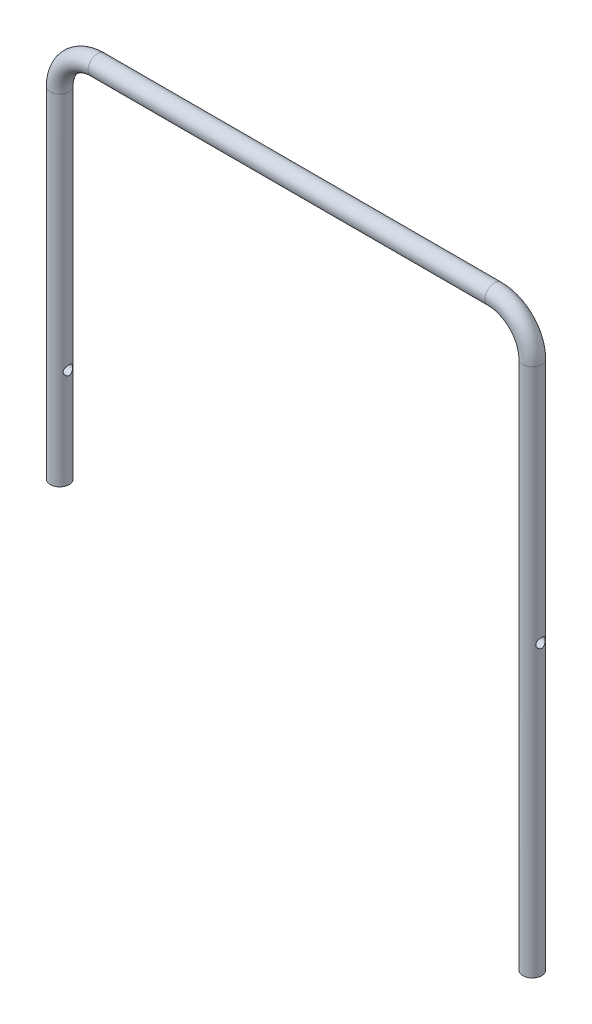
ISO-10303-21;
HEADER;
FILE_DESCRIPTION(('STEP AP214'),'2;1');
FILE_NAME('part.step','',(''),(''),'','','');
FILE_SCHEMA(('AUTOMOTIVE_DESIGN { 1 0 10303 214 1 1 1 1 }'));
ENDSEC;
DATA;
#1=APPLICATION_CONTEXT('core data for automotive mechanical design processes');
#2=APPLICATION_PROTOCOL_DEFINITION('international standard','automotive_design',2000,#1);
#3=PRODUCT_CONTEXT('',#1,'mechanical');
#4=PRODUCT('Part','Part','',(#3));
#5=PRODUCT_RELATED_PRODUCT_CATEGORY('part','',(#4));
#6=PRODUCT_DEFINITION_FORMATION('','',#4);
#7=PRODUCT_DEFINITION_CONTEXT('part definition',#1,'design');
#8=PRODUCT_DEFINITION('design','',#6,#7);
#9=PRODUCT_DEFINITION_SHAPE('','',#8);
#10=(LENGTH_UNIT() NAMED_UNIT(*) SI_UNIT(.MILLI.,.METRE.));
#11=(NAMED_UNIT(*) PLANE_ANGLE_UNIT() SI_UNIT($,.RADIAN.));
#12=(NAMED_UNIT(*) SI_UNIT($,.STERADIAN.) SOLID_ANGLE_UNIT());
#13=UNCERTAINTY_MEASURE_WITH_UNIT(LENGTH_MEASURE(1.E-05),#10,'distance_accuracy_value','');
#14=(GEOMETRIC_REPRESENTATION_CONTEXT(3) GLOBAL_UNCERTAINTY_ASSIGNED_CONTEXT((#13)) GLOBAL_UNIT_ASSIGNED_CONTEXT((#10,
#11,#12)) REPRESENTATION_CONTEXT('',''));
#15=CARTESIAN_POINT('',(0.,0.,0.));
#16=DIRECTION('',(0.,0.,1.));
#17=DIRECTION('',(1.,0.,0.));
#18=AXIS2_PLACEMENT_3D('',#15,#16,#17);
#19=CARTESIAN_POINT('',(0.,0.,0.));
#20=DIRECTION('',(0.,1.,0.));
#21=DIRECTION('',(0.,0.,1.));
#22=AXIS2_PLACEMENT_3D('',#19,#20,#21);
#23=PLANE('',#22);
#24=CARTESIAN_POINT('',(0.,0.,0.));
#25=DIRECTION('',(0.,1.,0.));
#26=DIRECTION('',(0.,0.,1.));
#27=AXIS2_PLACEMENT_3D('',#24,#25,#26);
#28=CIRCLE('',#27,5.);
#29=CARTESIAN_POINT('',(0.,0.,5.));
#30=VERTEX_POINT('',#29);
#31=EDGE_CURVE('E96',#30,#30,#28,.T.);
#32=ORIENTED_EDGE('',*,*,#31,.F.);
#33=EDGE_LOOP('',(#32));
#34=FACE_BOUND('',#33,.T.);
#35=ADVANCED_FACE('F43',(#34),#23,.F.);
#36=CARTESIAN_POINT('',(250.,-100.,0.));
#37=DIRECTION('',(0.,-1.,0.));
#38=DIRECTION('',(0.,0.,1.));
#39=AXIS2_PLACEMENT_3D('',#36,#37,#38);
#40=PLANE('',#39);
#41=CARTESIAN_POINT('',(250.,-100.,0.));
#42=DIRECTION('',(0.,-1.,0.));
#43=DIRECTION('',(0.,0.,1.));
#44=AXIS2_PLACEMENT_3D('',#41,#42,#43);
#45=CIRCLE('',#44,5.);
#46=CARTESIAN_POINT('',(250.,-100.,5.));
#47=VERTEX_POINT('',#46);
#48=EDGE_CURVE('E57',#47,#47,#45,.T.);
#49=ORIENTED_EDGE('',*,*,#48,.T.);
#50=EDGE_LOOP('',(#49));
#51=FACE_BOUND('',#50,.T.);
#52=ADVANCED_FACE('F133',(#51),#40,.T.);
#53=CARTESIAN_POINT('',(0.,0.,0.));
#54=DIRECTION('',(0.,1.,0.));
#55=DIRECTION('',(0.,0.,1.));
#56=AXIS2_PLACEMENT_3D('',#53,#54,#55);
#57=CYLINDRICAL_SURFACE('',#56,5.);
#58=CARTESIAN_POINT('',(4.33012701892219,52.5,-2.5));
#59=CARTESIAN_POINT('',(4.33013982272991,52.6302665068765,-2.49998948436432));
#60=CARTESIAN_POINT('',(4.33609541965583,52.7607027206763,-2.48974954513168));
#61=CARTESIAN_POINT('',(4.35905877051907,53.0175689715292,-2.44930840724944));
#62=CARTESIAN_POINT('',(4.37608974726023,53.1439900040573,-2.41906526369545));
#63=CARTESIAN_POINT('',(4.41873376871659,53.3886289455611,-2.3402497699757));
#64=CARTESIAN_POINT('',(4.44430111338921,53.5068865735622,-2.29177485369963));
#65=CARTESIAN_POINT('',(4.50106659111455,53.7335605630946,-2.17816884056414));
#66=CARTESIAN_POINT('',(4.53226502875883,53.8419763917958,-2.11303684262671));
#67=CARTESIAN_POINT('',(4.59992173524851,54.0557643039169,-1.96166634317253));
#68=CARTESIAN_POINT('',(4.63660159331577,54.1601478344898,-1.87413008816917));
#69=CARTESIAN_POINT('',(4.70929956727453,54.3535209757132,-1.68313452122752));
#70=CARTESIAN_POINT('',(4.74531734512768,54.442502907755,-1.57966731506052));
#71=CARTESIAN_POINT('',(4.81553692452135,54.6084178764857,-1.35122390789082));
#72=CARTESIAN_POINT('',(4.84945266064072,54.6841344192792,-1.22526797235894));
#73=CARTESIAN_POINT('',(4.90876890230193,54.8128521334839,-0.960392566671149));
#74=CARTESIAN_POINT('',(4.93417477954535,54.8658676404385,-0.821481345389986));
#75=CARTESIAN_POINT('',(4.9720115311507,54.943761653164,-0.545112359773526));
#76=CARTESIAN_POINT('',(4.98523700553425,54.9703738158652,-0.408254476210986));
#77=CARTESIAN_POINT('',(5.00018959613973,55.0004152967113,-0.131426571755679));
#78=CARTESIAN_POINT('',(5.00192366961168,55.0038586419954,0.00854151460650648));
#79=CARTESIAN_POINT('',(4.99407454791405,54.9881333150686,0.274581311061962));
#80=CARTESIAN_POINT('',(4.98546239730476,54.9709049611955,0.40080299794267));
#81=CARTESIAN_POINT('',(4.95935613149294,54.9177978902399,0.648284429795107));
#82=CARTESIAN_POINT('',(4.94186135165964,54.8819177775599,0.769543802734623));
#83=CARTESIAN_POINT('',(4.89928958219157,54.7922935847751,1.00577347892407));
#84=CARTESIAN_POINT('',(4.87411103823003,54.7383092170697,1.12063355878799));
#85=CARTESIAN_POINT('',(4.81844114966712,54.6143414594964,1.33994200378327));
#86=CARTESIAN_POINT('',(4.78794790393709,54.5443523417442,1.4443866220966));
#87=CARTESIAN_POINT('',(4.72110985998075,54.3827616211674,1.6504341522455));
#88=CARTESIAN_POINT('',(4.68448439995438,54.289742429185,1.7508351875734));
#89=CARTESIAN_POINT('',(4.61135851467029,54.0885256876746,1.93526092574444));
#90=CARTESIAN_POINT('',(4.57485820664072,53.9803165693149,2.01927302893557));
#91=CARTESIAN_POINT('',(4.50360390231212,53.7433795189398,2.17376333660553));
#92=CARTESIAN_POINT('',(4.46910799976769,53.6137849423645,2.24304328744513));
#93=CARTESIAN_POINT('',(4.4093862569644,53.3426558216025,2.35829778250308));
#94=CARTESIAN_POINT('',(4.38415075115168,53.2011339174561,2.40429664552722));
#95=CARTESIAN_POINT('',(4.34861589542586,52.921963721793,2.4679505275626));
#96=CARTESIAN_POINT('',(4.33729139621241,52.7848972023912,2.48756280529994));
#97=CARTESIAN_POINT('',(4.32794798404024,52.5089966462087,2.50379236652857));
#98=CARTESIAN_POINT('',(4.32991967223279,52.3701639272005,2.50042589328757));
#99=CARTESIAN_POINT('',(4.34585841351462,52.1108652035532,2.47259010835991));
#100=CARTESIAN_POINT('',(4.35848968766635,51.9900513722303,2.45046954178116));
#101=CARTESIAN_POINT('',(4.39235053878353,51.7540805343225,2.38924071158112));
#102=CARTESIAN_POINT('',(4.41358290012585,51.6389253731332,2.35012694655909));
#103=CARTESIAN_POINT('',(4.46340555199141,51.4114716727436,2.25411897151217));
#104=CARTESIAN_POINT('',(4.49229108107657,51.2995524578675,2.19648515923163));
#105=CARTESIAN_POINT('',(4.55390298743125,51.0863268211512,2.0657176600397));
#106=CARTESIAN_POINT('',(4.58663133387872,50.9850258912119,1.99257601083124));
#107=CARTESIAN_POINT('',(4.65719996140836,50.7825530811967,1.82209291799636));
#108=CARTESIAN_POINT('',(4.69516457885708,50.6830071232278,1.72286318078435));
#109=CARTESIAN_POINT('',(4.76835587444746,50.5014694049941,1.5085112384988));
#110=CARTESIAN_POINT('',(4.80358162519329,50.4194835743415,1.39338368664989));
#111=CARTESIAN_POINT('',(4.86853404227334,50.2735656852091,1.14633840638508));
#112=CARTESIAN_POINT('',(4.89809104179855,50.2101672047916,1.01405774389062));
#113=CARTESIAN_POINT('',(4.9470838739847,50.107155240038,0.738805911647337));
#114=CARTESIAN_POINT('',(4.96652859191746,50.0675208703949,0.595844253647071));
#115=CARTESIAN_POINT('',(4.99168770453968,50.0165785906436,0.31744920567471));
#116=CARTESIAN_POINT('',(4.99849819767838,50.0030053141697,0.18252860908538));
#117=CARTESIAN_POINT('',(5.00105325940467,49.9978918325054,-0.0878149643374281));
#118=CARTESIAN_POINT('',(4.99680170177042,50.0063439143389,-0.223237748727014));
#119=CARTESIAN_POINT('',(4.97834922085637,50.0435410303955,-0.48134498267107));
#120=CARTESIAN_POINT('',(4.96482236636807,50.0709121716363,-0.604280801321768));
#121=CARTESIAN_POINT('',(4.92980234191731,50.1433174497584,-0.843614873664451));
#122=CARTESIAN_POINT('',(4.90830802955518,50.1883541196337,-0.96001218708721));
#123=CARTESIAN_POINT('',(4.85814826741488,50.2968178187393,-1.18855854199592));
#124=CARTESIAN_POINT('',(4.82921542506803,50.3609490246899,-1.30031295715362));
#125=CARTESIAN_POINT('',(4.76720333344986,50.5048941101476,-1.51193650408535));
#126=CARTESIAN_POINT('',(4.73412218229105,50.5847151926269,-1.61180014305397));
#127=CARTESIAN_POINT('',(4.66321523550925,50.7669957944494,-1.80728542324369));
#128=CARTESIAN_POINT('',(4.62524489658367,50.8709177260007,-1.90149582349002));
#129=CARTESIAN_POINT('',(4.55157698284941,51.0936152853822,-2.07165660492503));
#130=CARTESIAN_POINT('',(4.51588143910584,51.2124039141992,-2.1475908315154));
#131=CARTESIAN_POINT('',(4.44998982823926,51.4666361176643,-2.28108393396028));
#132=CARTESIAN_POINT('',(4.42000320346984,51.6024873884246,-2.33798627977449));
#133=CARTESIAN_POINT('',(4.38370272660093,51.8132226495198,-2.40494911880459));
#134=CARTESIAN_POINT('',(4.37305486646054,51.8845597756976,-2.42419582683991));
#135=CARTESIAN_POINT('',(4.35507574170935,52.0290406968494,-2.45635087255789));
#136=CARTESIAN_POINT('',(4.34774215854234,52.1021831909544,-2.46926364179177));
#137=CARTESIAN_POINT('',(4.3382377954292,52.229500986547,-2.48591166201423));
#138=CARTESIAN_POINT('',(4.33520487024791,52.2834163215122,-2.49118864979202));
#139=CARTESIAN_POINT('',(4.33114674911323,52.3915446163104,-2.49823512543934));
#140=CARTESIAN_POINT('',(4.33012168747261,52.4457575958106,-2.50000437866475));
#141=CARTESIAN_POINT('',(4.33012701892219,52.5,-2.5));
#142=B_SPLINE_CURVE_WITH_KNOTS('',3,(#58,#59,#60,#61,#62,#63,#64,#65,#66,#67,#68,#69,#70,#71,
#72,#73,#74,#75,#76,#77,#78,#79,#80,#81,#82,#83,#84,#85,#86,#87,#88,#89,#90,#91,#92,#93,#94,#95,
#96,#97,#98,#99,#100,#101,#102,#103,#104,#105,#106,#107,#108,#109,#110,#111,#112,#113,#114,#115,
#116,#117,#118,#119,#120,#121,#122,#123,#124,#125,#126,#127,#128,#129,#130,#131,#132,#133,#134,
#135,#136,#137,#138,#139,#140,#141),.UNSPECIFIED.,.T.,.F.,(4,2,2,2,2,2,2,2,2,2,2,2,2,2,2,2,2,2,
2,2,2,2,2,2,2,2,2,2,2,2,2,2,2,2,2,2,2,2,2,2,2,4),(0.,0.390580306486788,0.781982232062008,
1.17132148982691,1.5606818136637,1.98215578129642,2.40383927716011,2.85394730601992,
3.30377067414811,3.72158712424921,4.13915059220183,4.52040243716429,4.90168281298721,
5.2882383683295,5.67493248380763,6.0981797864731,6.52175120619879,6.97222104328703,
7.42221935534345,7.83655727140613,8.25060232976015,8.61935458565146,8.9882263109524,
9.37418241020302,9.76033715555201,10.1951685895662,10.6301466245059,11.076604535375,
11.5226694952701,11.927806759788,12.3328021699001,12.7111106218381,13.0894733378512,
13.4840187680376,13.8787457525688,14.3127560463025,14.7471485711797,15.195268726016,
15.4189244153949,15.6424233996907,15.8050484542806,15.9676843870379),.UNSPECIFIED.);
#143=CARTESIAN_POINT('',(4.33012701892219,52.5,-2.5));
#144=VERTEX_POINT('',#143);
#145=EDGE_CURVE('E83',#144,#144,#142,.T.);
#146=ORIENTED_EDGE('',*,*,#145,.F.);
#147=EDGE_LOOP('',(#146));
#148=FACE_BOUND('',#147,.T.);
#149=CARTESIAN_POINT('',(-5.,55.,0.));
#150=CARTESIAN_POINT('',(-4.99999177550472,54.999990330944,-0.131426682334305));
#151=CARTESIAN_POINT('',(-4.99476199135277,54.989574438226,-0.263015634437212));
#152=CARTESIAN_POINT('',(-4.9743541856102,54.948368178838,-0.522301454622883));
#153=CARTESIAN_POINT('',(-4.9591572718767,54.917539119075,-0.649990448564105));
#154=CARTESIAN_POINT('',(-4.92040690922477,54.8370153772812,-0.897333631316204));
#155=CARTESIAN_POINT('',(-4.89688595907259,54.7873940122173,-1.01701694536277));
#156=CARTESIAN_POINT('',(-4.84364443325827,54.6710734737482,-1.24618160399671));
#157=CARTESIAN_POINT('',(-4.81392434644421,54.6043756468549,-1.3556637520377));
#158=CARTESIAN_POINT('',(-4.74890645050632,54.4512068683574,-1.56876952630998));
#159=CARTESIAN_POINT('',(-4.71337997659091,54.3637837997702,-1.67163802294309));
#160=CARTESIAN_POINT('',(-4.64149925776731,54.1736963040147,-1.86194861703333));
#161=CARTESIAN_POINT('',(-4.60514440566897,54.0710203711599,-1.94937895911556));
#162=CARTESIAN_POINT('',(-4.53247377945622,53.8437916255547,-2.11312999967247));
#163=CARTESIAN_POINT('',(-4.49637967412567,53.718159753965,-2.18806333849064));
#164=CARTESIAN_POINT('',(-4.43214946943555,53.4540816602046,-2.31542056761491));
#165=CARTESIAN_POINT('',(-4.40400769020792,53.3156446782374,-2.36786053751682));
#166=CARTESIAN_POINT('',(-4.36144667591402,53.0383372364036,-2.44533110537653));
#167=CARTESIAN_POINT('',(-4.34630678958452,52.8999888698204,-2.47181464267578));
#168=CARTESIAN_POINT('',(-4.3295472487215,52.6200529055624,-2.50106748329741));
#169=CARTESIAN_POINT('',(-4.3279142335843,52.4784686478249,-2.50386022093906));
#170=CARTESIAN_POINT('',(-4.33777325642937,52.2142849392091,-2.48671821792512));
#171=CARTESIAN_POINT('',(-4.34771909154984,52.0914399219417,-2.46946139884055));
#172=CARTESIAN_POINT('',(-4.37690571834675,51.8506952265681,-2.41734962264384));
#173=CARTESIAN_POINT('',(-4.39614947079454,51.7327971367369,-2.38248905974454));
#174=CARTESIAN_POINT('',(-4.44218691031839,51.5019271685857,-2.29552445096459));
#175=CARTESIAN_POINT('',(-4.46914601659993,51.3891340030355,-2.24303766778987));
#176=CARTESIAN_POINT('',(-4.52758510703513,51.1734142685251,-2.12260421917012));
#177=CARTESIAN_POINT('',(-4.55906711950477,51.0704921609998,-2.0546506095312));
#178=CARTESIAN_POINT('',(-4.62782894758213,50.8636968681419,-1.89516513728194));
#179=CARTESIAN_POINT('',(-4.66533775591865,50.7613578160596,-1.8017361459232));
#180=CARTESIAN_POINT('',(-4.73869058251019,50.5731614535228,-1.59888894685344));
#181=CARTESIAN_POINT('',(-4.77453379897003,50.4873120199153,-1.48946314143572));
#182=CARTESIAN_POINT('',(-4.84254968207409,50.3307858474257,-1.25129126457962));
#183=CARTESIAN_POINT('',(-4.87447460405015,50.2609988188857,-1.12188397899853));
#184=CARTESIAN_POINT('',(-4.92894702803108,50.1447574273925,-0.851165538721985));
#185=CARTESIAN_POINT('',(-4.95150197358893,50.0982845374621,-0.709863940663162));
#186=CARTESIAN_POINT('',(-4.98310834353579,50.0338114907083,-0.431916229151782));
#187=CARTESIAN_POINT('',(-4.9931234575324,50.013771910633,-0.295853826370908));
#188=CARTESIAN_POINT('',(-5.00182533647794,49.9963381721638,-0.0219489998732905));
#189=CARTESIAN_POINT('',(-5.00051746803426,49.9989332859015,0.115892549675107));
#190=CARTESIAN_POINT('',(-4.98727980633468,50.0255167210467,0.378082429964653));
#191=CARTESIAN_POINT('',(-4.97618114219992,50.0478313318244,0.502648520123702));
#192=CARTESIAN_POINT('',(-4.94555428287529,50.1105951797384,0.746017230755968));
#193=CARTESIAN_POINT('',(-4.92602515837625,50.1510464161359,0.864819214231881));
#194=CARTESIAN_POINT('',(-4.87960628532329,50.2499961660804,1.09722152111965));
#195=CARTESIAN_POINT('',(-4.85252204417873,50.3089776252823,1.21057599249831));
#196=CARTESIAN_POINT('',(-4.79359935799751,50.4427688391248,1.42615340426438));
#197=CARTESIAN_POINT('',(-4.76175888940534,50.5175853365199,1.52837157450203));
#198=CARTESIAN_POINT('',(-4.69270553315087,50.6894010632909,1.72941922315487));
#199=CARTESIAN_POINT('',(-4.65527212009488,50.7878571709752,1.82693019428496));
#200=CARTESIAN_POINT('',(-4.58155978921587,50.9998128780495,2.0046408025722));
#201=CARTESIAN_POINT('',(-4.54528168472407,51.1133227970699,2.08482846428685));
#202=CARTESIAN_POINT('',(-4.4762798054528,51.3591091354847,2.22926978618995));
#203=CARTESIAN_POINT('',(-4.44381323981254,51.4920281652912,2.29256373922244));
#204=CARTESIAN_POINT('',(-4.38935180726746,51.7687751688826,2.39520706511459));
#205=CARTESIAN_POINT('',(-4.36734345549014,51.912588816,2.43458729077056));
#206=CARTESIAN_POINT('',(-4.33903752569351,52.192275557363,2.48465421767005));
#207=CARTESIAN_POINT('',(-4.33143458674096,52.327585634119,2.4977324874436));
#208=CARTESIAN_POINT('',(-4.32913386592579,52.5986176673807,2.50172288950899));
#209=CARTESIAN_POINT('',(-4.3344304902511,52.7343394198736,2.49264462983266));
#210=CARTESIAN_POINT('',(-4.35594655164663,52.9887087556169,2.45481530197332));
#211=CARTESIAN_POINT('',(-4.37107736338133,53.1077511817208,2.42802074302696));
#212=CARTESIAN_POINT('',(-4.40927540337602,53.3395202922,2.35793843840544));
#213=CARTESIAN_POINT('',(-4.43234518434965,53.4522449315666,2.31464538728732));
#214=CARTESIAN_POINT('',(-4.48571326433413,53.6765621527197,2.20953919315538));
#215=CARTESIAN_POINT('',(-4.5163930799845,53.787569851735,2.14667719009403));
#216=CARTESIAN_POINT('',(-4.58088327077455,53.9981862432401,2.0053780838799));
#217=CARTESIAN_POINT('',(-4.61469526970767,54.0977889626287,1.92693287765888));
#218=CARTESIAN_POINT('',(-4.68655816327011,54.2953553637497,1.74550556946065));
#219=CARTESIAN_POINT('',(-4.7246249151498,54.3916493641714,1.6407002246921));
#220=CARTESIAN_POINT('',(-4.79694347383545,54.5656558494281,1.41539785420684));
#221=CARTESIAN_POINT('',(-4.83119321905446,54.6433583186059,1.29489242426333));
#222=CARTESIAN_POINT('',(-4.89245149457782,54.7780969794841,1.03978808878537));
#223=CARTESIAN_POINT('',(-4.91940711437488,54.8349831677845,0.905095560782291));
#224=CARTESIAN_POINT('',(-4.9517796092335,54.9021838587924,0.696328709257355));
#225=CARTESIAN_POINT('',(-4.96122314081874,54.9215553980018,0.625670413494093));
#226=CARTESIAN_POINT('',(-4.97717127275101,54.9540659483706,0.482623997839262));
#227=CARTESIAN_POINT('',(-4.98367766823159,54.9672087666764,0.410236963092405));
#228=CARTESIAN_POINT('',(-4.9923820076613,54.9847374722847,0.281518684621674));
#229=CARTESIAN_POINT('',(-4.99523288466454,54.9904549365313,0.225408499555446));
#230=CARTESIAN_POINT('',(-4.99904367329659,54.9980883294657,0.112875528456289));
#231=CARTESIAN_POINT('',(-5.00000353273198,55.0000041532255,0.0564527338382182));
#232=CARTESIAN_POINT('',(-5.,55.,0.));
#233=B_SPLINE_CURVE_WITH_KNOTS('',3,(#149,#150,#151,#152,#153,#154,#155,#156,#157,#158,#159,
#160,#161,#162,#163,#164,#165,#166,#167,#168,#169,#170,#171,#172,#173,#174,#175,#176,#177,#178,
#179,#180,#181,#182,#183,#184,#185,#186,#187,#188,#189,#190,#191,#192,#193,#194,#195,#196,#197,
#198,#199,#200,#201,#202,#203,#204,#205,#206,#207,#208,#209,#210,#211,#212,#213,#214,#215,#216,
#217,#218,#219,#220,#221,#222,#223,#224,#225,#226,#227,#228,#229,#230,#231,#232),.UNSPECIFIED.,
.T.,.F.,(4,2,2,2,2,2,2,2,2,2,2,2,2,2,2,2,2,2,2,2,2,2,2,2,2,2,2,2,2,2,2,2,2,2,2,2,2,2,2,2,2,4),
(0.,0.394060643550732,0.788870374272993,1.18215538873075,1.57540940145392,1.99245439679523,
2.40981559413509,2.85954316076881,3.30894869745702,3.73145030350573,4.15353393322551,
4.52514281023301,4.89687009814197,5.27725600421219,5.65781303150555,6.08662353334697,
6.51563836496716,6.96457555536102,7.41315542280699,7.82458226178364,8.2358141127869,
8.61517266265305,8.99457304077329,9.38482140069747,9.77523626870849,10.2039902661037,
10.6330397153795,11.0828670540368,11.53211279863,11.9382326875698,12.3441764966107,
12.7114482562151,13.0788382197025,13.4709114195009,13.8631890285845,14.303131068923,
14.7433095845248,15.1866003415819,15.407934939208,15.6291340766843,15.7983933645035,
15.9676573239323),.UNSPECIFIED.);
#234=CARTESIAN_POINT('',(-5.,55.,0.));
#235=VERTEX_POINT('',#234);
#236=EDGE_CURVE('E90',#235,#235,#233,.T.);
#237=ORIENTED_EDGE('',*,*,#236,.F.);
#238=EDGE_LOOP('',(#237));
#239=FACE_BOUND('',#238,.T.);
#240=CARTESIAN_POINT('',(0.,180.,0.));
#241=DIRECTION('',(0.,1.,0.));
#242=DIRECTION('',(0.,0.,1.));
#243=AXIS2_PLACEMENT_3D('',#240,#241,#242);
#244=CIRCLE('',#243,5.);
#245=CARTESIAN_POINT('',(-5.,180.,0.));
#246=VERTEX_POINT('',#245);
#247=EDGE_CURVE('E99',#246,#246,#244,.T.);
#248=ORIENTED_EDGE('',*,*,#247,.F.);
#249=EDGE_LOOP('',(#248));
#250=FACE_BOUND('',#249,.T.);
#251=ORIENTED_EDGE('',*,*,#31,.T.);
#252=EDGE_LOOP('',(#251));
#253=FACE_BOUND('',#252,.T.);
#254=ADVANCED_FACE('F73',(#148,#239,#250,#253),#57,.T.);
#255=CARTESIAN_POINT('',(20.,180.,0.));
#256=DIRECTION('',(0.,0.,-1.));
#257=DIRECTION('',(-1.,0.,0.));
#258=AXIS2_PLACEMENT_3D('',#255,#256,#257);
#259=TOROIDAL_SURFACE('',#258,20.,5.);
#260=CARTESIAN_POINT('',(20.0000000000001,200.,0.));
#261=DIRECTION('',(1.,0.,0.));
#262=DIRECTION('',(0.,0.,1.));
#263=AXIS2_PLACEMENT_3D('',#260,#261,#262);
#264=CIRCLE('',#263,5.);
#265=CARTESIAN_POINT('',(20.0000000000002,205.,0.));
#266=VERTEX_POINT('',#265);
#267=EDGE_CURVE('E102',#266,#266,#264,.T.);
#268=CARTESIAN_POINT('',(20.,180.,0.));
#269=DIRECTION('',(0.,0.,-1.));
#270=DIRECTION('',(-1.,0.,0.));
#271=AXIS2_PLACEMENT_3D('',#268,#269,#270);
#272=CIRCLE('',#271,25.);
#273=EDGE_CURVE('',#246,#266,#272,.T.);
#274=ORIENTED_EDGE('',*,*,#247,.T.);
#275=ORIENTED_EDGE('',*,*,#267,.F.);
#276=ORIENTED_EDGE('',*,*,#273,.T.);
#277=ORIENTED_EDGE('',*,*,#273,.F.);
#278=EDGE_LOOP('',(#274,#276,#275,#277));
#279=FACE_BOUND('',#278,.T.);
#280=ADVANCED_FACE('F122',(#279),#259,.T.);
#281=CARTESIAN_POINT('',(20.0000000000001,200.,0.));
#282=DIRECTION('',(1.,0.,0.));
#283=DIRECTION('',(0.,0.,-1.));
#284=AXIS2_PLACEMENT_3D('',#281,#282,#283);
#285=CYLINDRICAL_SURFACE('',#284,5.);
#286=CARTESIAN_POINT('',(230.,200.,0.));
#287=DIRECTION('',(1.,0.,0.));
#288=DIRECTION('',(0.,0.,1.));
#289=AXIS2_PLACEMENT_3D('',#286,#287,#288);
#290=CIRCLE('',#289,5.);
#291=CARTESIAN_POINT('',(230.,205.,0.));
#292=VERTEX_POINT('',#291);
#293=EDGE_CURVE('E107',#292,#292,#290,.T.);
#294=ORIENTED_EDGE('',*,*,#293,.F.);
#295=EDGE_LOOP('',(#294));
#296=FACE_BOUND('',#295,.T.);
#297=ORIENTED_EDGE('',*,*,#267,.T.);
#298=EDGE_LOOP('',(#297));
#299=FACE_BOUND('',#298,.T.);
#300=ADVANCED_FACE('F118',(#296,#299),#285,.T.);
#301=CARTESIAN_POINT('',(230.,180.,0.));
#302=DIRECTION('',(0.,0.,-1.));
#303=DIRECTION('',(-1.,0.,0.));
#304=AXIS2_PLACEMENT_3D('',#301,#302,#303);
#305=TOROIDAL_SURFACE('',#304,20.,5.);
#306=CARTESIAN_POINT('',(250.,180.,0.));
#307=DIRECTION('',(0.,-1.,0.));
#308=DIRECTION('',(0.,0.,1.));
#309=AXIS2_PLACEMENT_3D('',#306,#307,#308);
#310=CIRCLE('',#309,5.);
#311=CARTESIAN_POINT('',(255.,180.,0.));
#312=VERTEX_POINT('',#311);
#313=EDGE_CURVE('E64',#312,#312,#310,.T.);
#314=CARTESIAN_POINT('',(230.,180.,0.));
#315=DIRECTION('',(0.,0.,-1.));
#316=DIRECTION('',(-1.,0.,0.));
#317=AXIS2_PLACEMENT_3D('',#314,#315,#316);
#318=CIRCLE('',#317,25.);
#319=EDGE_CURVE('',#292,#312,#318,.T.);
#320=ORIENTED_EDGE('',*,*,#293,.T.);
#321=ORIENTED_EDGE('',*,*,#313,.F.);
#322=ORIENTED_EDGE('',*,*,#319,.T.);
#323=ORIENTED_EDGE('',*,*,#319,.F.);
#324=EDGE_LOOP('',(#320,#322,#321,#323));
#325=FACE_BOUND('',#324,.T.);
#326=ADVANCED_FACE('F119',(#325),#305,.T.);
#327=CARTESIAN_POINT('',(250.,180.,0.));
#328=DIRECTION('',(0.,-1.,0.));
#329=DIRECTION('',(1.,0.,0.));
#330=AXIS2_PLACEMENT_3D('',#327,#328,#329);
#331=CYLINDRICAL_SURFACE('',#330,5.);
#332=CARTESIAN_POINT('',(245.669872981078,52.5,-2.5));
#333=CARTESIAN_POINT('',(245.66986017727,52.3697334931235,-2.49998948436432));
#334=CARTESIAN_POINT('',(245.663904580344,52.2392972793238,-2.48974954513168));
#335=CARTESIAN_POINT('',(245.640941229481,51.9824310284708,-2.44930840724944));
#336=CARTESIAN_POINT('',(245.62391025274,51.8560099959427,-2.41906526369545));
#337=CARTESIAN_POINT('',(245.581266231283,51.611371054439,-2.3402497699757));
#338=CARTESIAN_POINT('',(245.555698886611,51.4931134264378,-2.29177485369963));
#339=CARTESIAN_POINT('',(245.498933408885,51.2664394369055,-2.17816884056414));
#340=CARTESIAN_POINT('',(245.467734971241,51.1580236082042,-2.11303684262671));
#341=CARTESIAN_POINT('',(245.400078264752,50.9442356960831,-1.96166634317253));
#342=CARTESIAN_POINT('',(245.363398406684,50.8398521655102,-1.87413008816916));
#343=CARTESIAN_POINT('',(245.290700432725,50.6464790242868,-1.68313452122751));
#344=CARTESIAN_POINT('',(245.254682654872,50.5574970922451,-1.57966731506051));
#345=CARTESIAN_POINT('',(245.184463075479,50.3915821235144,-1.35122390789081));
#346=CARTESIAN_POINT('',(245.150547339359,50.3158655807209,-1.22526797235894));
#347=CARTESIAN_POINT('',(245.091231097698,50.1871478665162,-0.96039256667114));
#348=CARTESIAN_POINT('',(245.065825220455,50.1341323595615,-0.821481345389977));
#349=CARTESIAN_POINT('',(245.027988468849,50.056238346836,-0.545112359773515));
#350=CARTESIAN_POINT('',(245.014762994466,50.0296261841349,-0.408254476210974));
#351=CARTESIAN_POINT('',(244.99981040386,49.9995847032887,-0.131426571755668));
#352=CARTESIAN_POINT('',(244.998076330388,49.9961413580047,0.00854151460651515));
#353=CARTESIAN_POINT('',(245.005925452086,50.0118666849314,0.274581311061969));
#354=CARTESIAN_POINT('',(245.014537602695,50.0290950388046,0.400802997942676));
#355=CARTESIAN_POINT('',(245.040643868507,50.0822021097602,0.648284429795113));
#356=CARTESIAN_POINT('',(245.05813864834,50.1180822224402,0.769543802734628));
#357=CARTESIAN_POINT('',(245.100710417808,50.207706415225,1.00577347892408));
#358=CARTESIAN_POINT('',(245.12588896177,50.2616907829303,1.12063355878801));
#359=CARTESIAN_POINT('',(245.181558850333,50.3856585405036,1.33994200378328));
#360=CARTESIAN_POINT('',(245.212052096063,50.4556476582559,1.44438662209661));
#361=CARTESIAN_POINT('',(245.278890140019,50.6172383788326,1.65043415224551));
#362=CARTESIAN_POINT('',(245.315515600046,50.7102575708151,1.75083518757341));
#363=CARTESIAN_POINT('',(245.38864148533,50.9114743123254,1.93526092574445));
#364=CARTESIAN_POINT('',(245.425141793359,51.0196834306852,2.01927302893558));
#365=CARTESIAN_POINT('',(245.496396097688,51.2566204810602,2.17376333660553));
#366=CARTESIAN_POINT('',(245.530892000232,51.3862150576355,2.24304328744513));
#367=CARTESIAN_POINT('',(245.590613743036,51.6573441783975,2.35829778250308));
#368=CARTESIAN_POINT('',(245.615849248848,51.7988660825439,2.40429664552723));
#369=CARTESIAN_POINT('',(245.651384104574,52.078036278207,2.4679505275626));
#370=CARTESIAN_POINT('',(245.662708603788,52.2151027976089,2.48756280529994));
#371=CARTESIAN_POINT('',(245.67205201596,52.4910033537914,2.50379236652857));
#372=CARTESIAN_POINT('',(245.670080327767,52.6298360727995,2.50042589328757));
#373=CARTESIAN_POINT('',(245.654141586485,52.8891347964468,2.47259010835991));
#374=CARTESIAN_POINT('',(245.641510312334,53.0099486277698,2.45046954178116));
#375=CARTESIAN_POINT('',(245.607649461216,53.2459194656775,2.38924071158111));
#376=CARTESIAN_POINT('',(245.586417099874,53.3610746268669,2.35012694655908));
#377=CARTESIAN_POINT('',(245.536594448009,53.5885283272564,2.25411897151217));
#378=CARTESIAN_POINT('',(245.507708918923,53.7004475421326,2.19648515923162));
#379=CARTESIAN_POINT('',(245.446097012569,53.9136731788488,2.06571766003969));
#380=CARTESIAN_POINT('',(245.413368666121,54.0149741087882,1.99257601083123));
#381=CARTESIAN_POINT('',(245.342800038592,54.2174469188033,1.82209291799635));
#382=CARTESIAN_POINT('',(245.304835421143,54.3169928767723,1.72286318078434));
#383=CARTESIAN_POINT('',(245.231644125553,54.4985305950059,1.50851123849879));
#384=CARTESIAN_POINT('',(245.196418374807,54.5805164256586,1.39338368664988));
#385=CARTESIAN_POINT('',(245.131465957727,54.7264343147909,1.14633840638507));
#386=CARTESIAN_POINT('',(245.101908958201,54.7898327952085,1.01405774389061));
#387=CARTESIAN_POINT('',(245.052916126015,54.892844759962,0.738805911647324));
#388=CARTESIAN_POINT('',(245.033471408083,54.9324791296051,0.59584425364706));
#389=CARTESIAN_POINT('',(245.00831229546,54.9834214093564,0.317449205674698));
#390=CARTESIAN_POINT('',(245.001501802322,54.9969946858304,0.182528609085368));
#391=CARTESIAN_POINT('',(244.998946740595,55.0021081674946,-0.0878149643374389));
#392=CARTESIAN_POINT('',(245.00319829823,54.9936560856611,-0.223237748727024));
#393=CARTESIAN_POINT('',(245.021650779144,54.9564589696045,-0.481344982671081));
#394=CARTESIAN_POINT('',(245.035177633632,54.9290878283637,-0.604280801321781));
#395=CARTESIAN_POINT('',(245.070197658083,54.8566825502417,-0.843614873664464));
#396=CARTESIAN_POINT('',(245.091691970445,54.8116458803664,-0.960012187087222));
#397=CARTESIAN_POINT('',(245.141851732585,54.7031821812608,-1.18855854199593));
#398=CARTESIAN_POINT('',(245.170784574932,54.6390509753102,-1.30031295715363));
#399=CARTESIAN_POINT('',(245.23279666655,54.4951058898524,-1.51193650408536));
#400=CARTESIAN_POINT('',(245.265877817709,54.4152848073731,-1.61180014305398));
#401=CARTESIAN_POINT('',(245.336784764491,54.2330042055506,-1.8072854232437));
#402=CARTESIAN_POINT('',(245.374755103416,54.1290822739993,-1.90149582349003));
#403=CARTESIAN_POINT('',(245.448423017151,53.9063847146178,-2.07165660492505));
#404=CARTESIAN_POINT('',(245.484118560894,53.7875960858008,-2.14759083151541));
#405=CARTESIAN_POINT('',(245.550010171761,53.5333638823357,-2.28108393396029));
#406=CARTESIAN_POINT('',(245.57999679653,53.3975126115754,-2.3379862797745));
#407=CARTESIAN_POINT('',(245.616297273399,53.1867773504802,-2.40494911880459));
#408=CARTESIAN_POINT('',(245.626945133539,53.1154402243024,-2.42419582683991));
#409=CARTESIAN_POINT('',(245.644924258291,52.9709593031507,-2.45635087255789));
#410=CARTESIAN_POINT('',(245.652257841458,52.8978168090456,-2.46926364179177));
#411=CARTESIAN_POINT('',(245.661762204571,52.7704990134531,-2.48591166201423));
#412=CARTESIAN_POINT('',(245.664795129752,52.7165836784878,-2.49118864979203));
#413=CARTESIAN_POINT('',(245.668853250887,52.6084553836896,-2.49823512543934));
#414=CARTESIAN_POINT('',(245.669878312527,52.5542424041895,-2.50000437866475));
#415=CARTESIAN_POINT('',(245.669872981078,52.5,-2.5));
#416=B_SPLINE_CURVE_WITH_KNOTS('',3,(#332,#333,#334,#335,#336,#337,#338,#339,#340,#341,#342,
#343,#344,#345,#346,#347,#348,#349,#350,#351,#352,#353,#354,#355,#356,#357,#358,#359,#360,#361,
#362,#363,#364,#365,#366,#367,#368,#369,#370,#371,#372,#373,#374,#375,#376,#377,#378,#379,#380,
#381,#382,#383,#384,#385,#386,#387,#388,#389,#390,#391,#392,#393,#394,#395,#396,#397,#398,#399,
#400,#401,#402,#403,#404,#405,#406,#407,#408,#409,#410,#411,#412,#413,#414,#415),.UNSPECIFIED.,
.T.,.F.,(4,2,2,2,2,2,2,2,2,2,2,2,2,2,2,2,2,2,2,2,2,2,2,2,2,2,2,2,2,2,2,2,2,2,2,2,2,2,2,2,2,4),
(0.,0.390580306486787,0.781982232062016,1.17132148982691,1.56068181366371,1.98215578129644,
2.40383927716011,2.85394730601992,3.30377067414812,3.72158712424922,4.13915059220184,
4.5204024371643,4.90168281298722,5.28823836832951,5.67493248380764,6.0981797864731,
6.5217512061988,6.97222104328704,7.42221935534346,7.83655727140612,8.25060232976016,
8.61935458565148,8.98822631095242,9.37418241020303,9.76033715555203,10.1951685895662,
10.6301466245059,11.076604535375,11.5226694952701,11.927806759788,12.3328021699001,
12.7111106218382,13.0894733378512,13.4840187680376,13.8787457525688,14.3127560463025,
14.7471485711797,15.195268726016,15.4189244153949,15.6424233996907,15.8050484542806,
15.9676843870379),.UNSPECIFIED.);
#417=CARTESIAN_POINT('',(245.669872981078,52.5,-2.5));
#418=VERTEX_POINT('',#417);
#419=EDGE_CURVE('E46',#418,#418,#416,.T.);
#420=ORIENTED_EDGE('',*,*,#419,.F.);
#421=EDGE_LOOP('',(#420));
#422=FACE_BOUND('',#421,.T.);
#423=CARTESIAN_POINT('',(255.,55.,0.));
#424=CARTESIAN_POINT('',(254.999991775505,54.999990330944,0.131426682334306));
#425=CARTESIAN_POINT('',(254.994761991353,54.989574438226,0.263015634437214));
#426=CARTESIAN_POINT('',(254.97435418561,54.948368178838,0.522301454622885));
#427=CARTESIAN_POINT('',(254.959157271877,54.917539119075,0.649990448564107));
#428=CARTESIAN_POINT('',(254.920406909225,54.8370153772812,0.897333631316211));
#429=CARTESIAN_POINT('',(254.896885959073,54.7873940122173,1.01701694536278));
#430=CARTESIAN_POINT('',(254.843644433258,54.6710734737482,1.24618160399672));
#431=CARTESIAN_POINT('',(254.813924346444,54.6043756468549,1.35566375203771));
#432=CARTESIAN_POINT('',(254.748906450506,54.4512068683574,1.56876952630999));
#433=CARTESIAN_POINT('',(254.713379976591,54.3637837997702,1.67163802294309));
#434=CARTESIAN_POINT('',(254.641499257767,54.1736963040147,1.86194861703333));
#435=CARTESIAN_POINT('',(254.605144405669,54.0710203711599,1.94937895911556));
#436=CARTESIAN_POINT('',(254.532473779456,53.8437916255547,2.11312999967247));
#437=CARTESIAN_POINT('',(254.496379674126,53.718159753965,2.18806333849064));
#438=CARTESIAN_POINT('',(254.432149469436,53.4540816602046,2.31542056761491));
#439=CARTESIAN_POINT('',(254.404007690208,53.3156446782374,2.36786053751682));
#440=CARTESIAN_POINT('',(254.361446675914,53.0383372364036,2.44533110537653));
#441=CARTESIAN_POINT('',(254.346306789585,52.8999888698204,2.47181464267578));
#442=CARTESIAN_POINT('',(254.329547248722,52.6200529055624,2.50106748329741));
#443=CARTESIAN_POINT('',(254.327914233584,52.4784686478249,2.50386022093906));
#444=CARTESIAN_POINT('',(254.337773256429,52.2142849392091,2.48671821792512));
#445=CARTESIAN_POINT('',(254.34771909155,52.0914399219417,2.46946139884055));
#446=CARTESIAN_POINT('',(254.376905718347,51.8506952265681,2.41734962264383));
#447=CARTESIAN_POINT('',(254.396149470795,51.7327971367369,2.38248905974453));
#448=CARTESIAN_POINT('',(254.442186910318,51.5019271685857,2.29552445096459));
#449=CARTESIAN_POINT('',(254.4691460166,51.3891340030355,2.24303766778987));
#450=CARTESIAN_POINT('',(254.527585107035,51.173414268525,2.12260421917011));
#451=CARTESIAN_POINT('',(254.559067119505,51.0704921609998,2.05465060953119));
#452=CARTESIAN_POINT('',(254.627828947582,50.8636968681419,1.89516513728193));
#453=CARTESIAN_POINT('',(254.665337755919,50.7613578160596,1.80173614592319));
#454=CARTESIAN_POINT('',(254.73869058251,50.5731614535228,1.59888894685344));
#455=CARTESIAN_POINT('',(254.77453379897,50.4873120199153,1.4894631414357));
#456=CARTESIAN_POINT('',(254.842549682074,50.3307858474257,1.2512912645796));
#457=CARTESIAN_POINT('',(254.87447460405,50.2609988188857,1.12188397899851));
#458=CARTESIAN_POINT('',(254.928947028031,50.1447574273925,0.851165538721972));
#459=CARTESIAN_POINT('',(254.951501973589,50.0982845374621,0.709863940663151));
#460=CARTESIAN_POINT('',(254.983108343536,50.0338114907083,0.43191622915177));
#461=CARTESIAN_POINT('',(254.993123457532,50.013771910633,0.295853826370895));
#462=CARTESIAN_POINT('',(255.001825336478,49.9963381721638,0.0219489998732774));
#463=CARTESIAN_POINT('',(255.000517468034,49.9989332859015,-0.11589254967512));
#464=CARTESIAN_POINT('',(254.987279806335,50.0255167210467,-0.378082429964664));
#465=CARTESIAN_POINT('',(254.9761811422,50.0478313318244,-0.502648520123712));
#466=CARTESIAN_POINT('',(254.945554282875,50.1105951797384,-0.746017230755977));
#467=CARTESIAN_POINT('',(254.926025158376,50.1510464161359,-0.86481921423189));
#468=CARTESIAN_POINT('',(254.879606285323,50.2499961660804,-1.09722152111966));
#469=CARTESIAN_POINT('',(254.852522044179,50.3089776252823,-1.21057599249832));
#470=CARTESIAN_POINT('',(254.793599357998,50.4427688391248,-1.4261534042644));
#471=CARTESIAN_POINT('',(254.761758889405,50.5175853365199,-1.52837157450204));
#472=CARTESIAN_POINT('',(254.692705533151,50.6894010632909,-1.72941922315488));
#473=CARTESIAN_POINT('',(254.655272120095,50.7878571709752,-1.82693019428497));
#474=CARTESIAN_POINT('',(254.581559789216,50.9998128780495,-2.00464080257221));
#475=CARTESIAN_POINT('',(254.545281684724,51.1133227970699,-2.08482846428686));
#476=CARTESIAN_POINT('',(254.476279805453,51.3591091354847,-2.22926978618995));
#477=CARTESIAN_POINT('',(254.443813239813,51.4920281652912,-2.29256373922244));
#478=CARTESIAN_POINT('',(254.389351807267,51.7687751688826,-2.39520706511459));
#479=CARTESIAN_POINT('',(254.36734345549,51.912588816,-2.43458729077056));
#480=CARTESIAN_POINT('',(254.339037525694,52.192275557363,-2.48465421767006));
#481=CARTESIAN_POINT('',(254.331434586741,52.327585634119,-2.49773248744361));
#482=CARTESIAN_POINT('',(254.329133865926,52.5986176673807,-2.50172288950898));
#483=CARTESIAN_POINT('',(254.334430490251,52.7343394198737,-2.49264462983266));
#484=CARTESIAN_POINT('',(254.355946551647,52.9887087556169,-2.45481530197331));
#485=CARTESIAN_POINT('',(254.371077363381,53.1077511817208,-2.42802074302696));
#486=CARTESIAN_POINT('',(254.409275403376,53.3395202922,-2.35793843840543));
#487=CARTESIAN_POINT('',(254.43234518435,53.4522449315666,-2.31464538728732));
#488=CARTESIAN_POINT('',(254.485713264334,53.6765621527198,-2.20953919315537));
#489=CARTESIAN_POINT('',(254.516393079985,53.7875698517351,-2.14667719009402));
#490=CARTESIAN_POINT('',(254.580883270775,53.9981862432401,-2.00537808387988));
#491=CARTESIAN_POINT('',(254.614695269708,54.0977889626288,-1.92693287765887));
#492=CARTESIAN_POINT('',(254.68655816327,54.2953553637497,-1.74550556946064));
#493=CARTESIAN_POINT('',(254.72462491515,54.3916493641714,-1.64070022469208));
#494=CARTESIAN_POINT('',(254.796943473835,54.5656558494281,-1.41539785420682));
#495=CARTESIAN_POINT('',(254.831193219055,54.6433583186059,-1.2948924242633));
#496=CARTESIAN_POINT('',(254.892451494578,54.7780969794841,-1.03978808878534));
#497=CARTESIAN_POINT('',(254.919407114375,54.8349831677845,-0.905095560782255));
#498=CARTESIAN_POINT('',(254.951779609234,54.9021838587924,-0.696328709257323));
#499=CARTESIAN_POINT('',(254.961223140819,54.9215553980018,-0.625670413494063));
#500=CARTESIAN_POINT('',(254.977171272751,54.9540659483706,-0.482623997839235));
#501=CARTESIAN_POINT('',(254.983677668232,54.9672087666764,-0.410236963092379));
#502=CARTESIAN_POINT('',(254.992382007661,54.9847374722847,-0.281518684621653));
#503=CARTESIAN_POINT('',(254.995232884665,54.9904549365313,-0.225408499555431));
#504=CARTESIAN_POINT('',(254.999043673297,54.9980883294657,-0.112875528456282));
#505=CARTESIAN_POINT('',(255.000003532732,55.0000041532255,-0.0564527338382144));
#506=CARTESIAN_POINT('',(255.,55.,0.));
#507=B_SPLINE_CURVE_WITH_KNOTS('',3,(#423,#424,#425,#426,#427,#428,#429,#430,#431,#432,#433,
#434,#435,#436,#437,#438,#439,#440,#441,#442,#443,#444,#445,#446,#447,#448,#449,#450,#451,#452,
#453,#454,#455,#456,#457,#458,#459,#460,#461,#462,#463,#464,#465,#466,#467,#468,#469,#470,#471,
#472,#473,#474,#475,#476,#477,#478,#479,#480,#481,#482,#483,#484,#485,#486,#487,#488,#489,#490,
#491,#492,#493,#494,#495,#496,#497,#498,#499,#500,#501,#502,#503,#504,#505,#506),.UNSPECIFIED.,
.T.,.F.,(4,2,2,2,2,2,2,2,2,2,2,2,2,2,2,2,2,2,2,2,2,2,2,2,2,2,2,2,2,2,2,2,2,2,2,2,2,2,2,2,2,4),
(0.,0.394060643550732,0.788870374272997,1.18215538873077,1.57540940145393,1.99245439679523,
2.40981559413508,2.85954316076881,3.30894869745701,3.73145030350575,4.15353393322551,
4.52514281023302,4.89687009814197,5.27725600421219,5.65781303150555,6.08662353334696,
6.51563836496717,6.96457555536103,7.413155422807,7.82458226178365,8.23581411278691,
8.61517266265305,8.99457304077329,9.38482140069748,9.77523626870849,10.2039902661037,
10.6330397153795,11.0828670540368,11.53211279863,11.9382326875699,12.3441764966107,
12.7114482562151,13.0788382197025,13.4709114195009,13.8631890285845,14.303131068923,
14.7433095845249,15.1866003415819,15.407934939208,15.6291340766844,15.7983933645035,
15.9676573239323),.UNSPECIFIED.);
#508=CARTESIAN_POINT('',(255.,55.,0.));
#509=VERTEX_POINT('',#508);
#510=EDGE_CURVE('E10',#509,#509,#507,.T.);
#511=ORIENTED_EDGE('',*,*,#510,.F.);
#512=EDGE_LOOP('',(#511));
#513=FACE_BOUND('',#512,.T.);
#514=ORIENTED_EDGE('',*,*,#48,.F.);
#515=EDGE_LOOP('',(#514));
#516=FACE_BOUND('',#515,.T.);
#517=ORIENTED_EDGE('',*,*,#313,.T.);
#518=EDGE_LOOP('',(#517));
#519=FACE_BOUND('',#518,.T.);
#520=ADVANCED_FACE('F70',(#422,#513,#516,#519),#331,.T.);
#521=CARTESIAN_POINT('',(-5.,52.5,0.));
#522=DIRECTION('',(1.,0.,0.));
#523=DIRECTION('',(0.,0.,-1.));
#524=AXIS2_PLACEMENT_3D('',#521,#522,#523);
#525=CYLINDRICAL_SURFACE('',#524,2.5);
#526=ORIENTED_EDGE('',*,*,#510,.T.);
#527=EDGE_LOOP('',(#526));
#528=FACE_BOUND('',#527,.T.);
#529=ORIENTED_EDGE('',*,*,#419,.T.);
#530=EDGE_LOOP('',(#529));
#531=FACE_BOUND('',#530,.T.);
#532=ADVANCED_FACE('F69',(#528,#531),#525,.F.);
#533=ORIENTED_EDGE('',*,*,#236,.T.);
#534=EDGE_LOOP('',(#533));
#535=FACE_BOUND('',#534,.T.);
#536=ORIENTED_EDGE('',*,*,#145,.T.);
#537=EDGE_LOOP('',(#536));
#538=FACE_BOUND('',#537,.T.);
#539=ADVANCED_FACE('F74',(#535,#538),#525,.F.);
#540=CLOSED_SHELL('',(#35,#52,#254,#280,#300,#326,#520,#532,#539));
#541=MANIFOLD_SOLID_BREP('B2',#540);
#542=ADVANCED_BREP_SHAPE_REPRESENTATION('',(#18,#541),#14);
#543=SHAPE_DEFINITION_REPRESENTATION(#9,#542);
ENDSEC;
END-ISO-10303-21;
